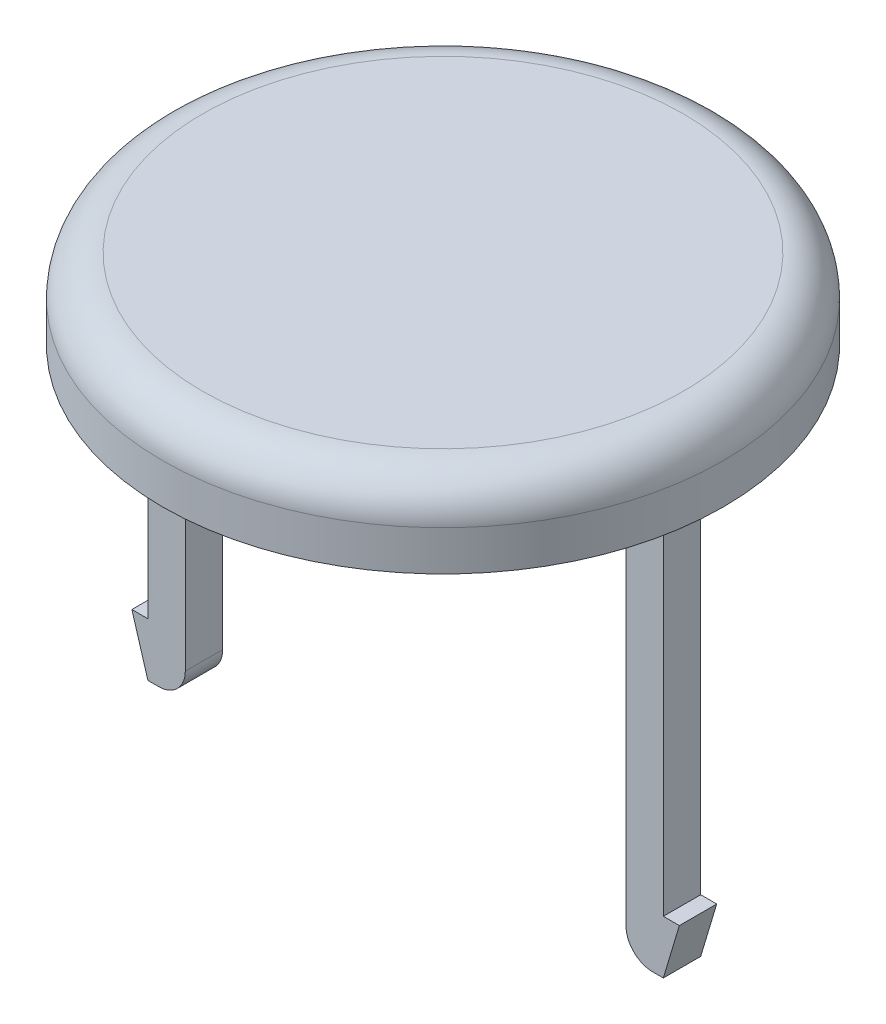
ISO-10303-21;
HEADER;
FILE_DESCRIPTION(('STEP AP214'),'2;1');
FILE_NAME('part.step','',(''),(''),'','','');
FILE_SCHEMA(('AUTOMOTIVE_DESIGN { 1 0 10303 214 1 1 1 1 }'));
ENDSEC;
DATA;
#1=APPLICATION_CONTEXT('core data for automotive mechanical design processes');
#2=APPLICATION_PROTOCOL_DEFINITION('international standard','automotive_design',2000,#1);
#3=PRODUCT_CONTEXT('',#1,'mechanical');
#4=PRODUCT('Part','Part','',(#3));
#5=PRODUCT_RELATED_PRODUCT_CATEGORY('part','',(#4));
#6=PRODUCT_DEFINITION_FORMATION('','',#4);
#7=PRODUCT_DEFINITION_CONTEXT('part definition',#1,'design');
#8=PRODUCT_DEFINITION('design','',#6,#7);
#9=PRODUCT_DEFINITION_SHAPE('','',#8);
#10=(LENGTH_UNIT() NAMED_UNIT(*) SI_UNIT(.MILLI.,.METRE.));
#11=(NAMED_UNIT(*) PLANE_ANGLE_UNIT() SI_UNIT($,.RADIAN.));
#12=(NAMED_UNIT(*) SI_UNIT($,.STERADIAN.) SOLID_ANGLE_UNIT());
#13=UNCERTAINTY_MEASURE_WITH_UNIT(LENGTH_MEASURE(1.E-05),#10,'distance_accuracy_value','');
#14=(GEOMETRIC_REPRESENTATION_CONTEXT(3) GLOBAL_UNCERTAINTY_ASSIGNED_CONTEXT((#13)) GLOBAL_UNIT_ASSIGNED_CONTEXT((#10,
#11,#12)) REPRESENTATION_CONTEXT('',''));
#15=CARTESIAN_POINT('',(0.,0.,0.));
#16=DIRECTION('',(0.,0.,1.));
#17=DIRECTION('',(1.,0.,0.));
#18=AXIS2_PLACEMENT_3D('',#15,#16,#17);
#19=CARTESIAN_POINT('',(9.65,-15.,0.));
#20=DIRECTION('',(-1.,0.,0.));
#21=DIRECTION('',(0.,0.,1.));
#22=AXIS2_PLACEMENT_3D('',#19,#20,#21);
#23=PLANE('',#22);
#24=DIRECTION('',(0.,0.,1.));
#25=VECTOR('',#24,1.);
#26=CARTESIAN_POINT('',(9.65,-13.,-2.08806130178211));
#27=LINE('',#26,#25);
#28=CARTESIAN_POINT('',(9.65,-13.,0.));
#29=VERTEX_POINT('',#28);
#30=CARTESIAN_POINT('',(9.65,-13.,1.4));
#31=VERTEX_POINT('',#30);
#32=EDGE_CURVE('E146',#29,#31,#27,.T.);
#33=ORIENTED_EDGE('',*,*,#32,.F.);
#34=DIRECTION('',(0.,1.,0.));
#35=VECTOR('',#34,1.);
#36=CARTESIAN_POINT('',(9.65,-15.,0.));
#37=LINE('',#36,#35);
#38=CARTESIAN_POINT('',(9.65,0.,0.));
#39=VERTEX_POINT('',#38);
#40=EDGE_CURVE('E160',#29,#39,#37,.T.);
#41=ORIENTED_EDGE('',*,*,#40,.T.);
#42=DIRECTION('',(0.,0.,1.));
#43=VECTOR('',#42,1.);
#44=CARTESIAN_POINT('',(9.65,0.,0.));
#45=LINE('',#44,#43);
#46=CARTESIAN_POINT('',(9.65,0.,1.4));
#47=VERTEX_POINT('',#46);
#48=EDGE_CURVE('E363',#39,#47,#45,.T.);
#49=ORIENTED_EDGE('',*,*,#48,.T.);
#50=DIRECTION('',(0.,1.,0.));
#51=VECTOR('',#50,1.);
#52=CARTESIAN_POINT('',(9.65,-15.,1.4));
#53=LINE('',#52,#51);
#54=EDGE_CURVE('E162',#31,#47,#53,.T.);
#55=ORIENTED_EDGE('',*,*,#54,.F.);
#56=EDGE_LOOP('',(#33,#41,#49,#55));
#57=FACE_BOUND('',#56,.T.);
#58=ADVANCED_FACE('F41',(#57),#23,.F.);
#59=CARTESIAN_POINT('',(0.,0.,0.));
#60=DIRECTION('',(0.,1.,0.));
#61=DIRECTION('',(0.,0.,1.));
#62=AXIS2_PLACEMENT_3D('',#59,#60,#61);
#63=PLANE('',#62);
#64=CARTESIAN_POINT('',(0.,0.,0.));
#65=DIRECTION('',(0.,1.,0.));
#66=DIRECTION('',(0.,0.,1.));
#67=AXIS2_PLACEMENT_3D('',#64,#65,#66);
#68=CIRCLE('',#67,10.5);
#69=CARTESIAN_POINT('',(0.,0.,10.5));
#70=VERTEX_POINT('',#69);
#71=EDGE_CURVE('E247',#70,#70,#68,.T.);
#72=ORIENTED_EDGE('',*,*,#71,.F.);
#73=EDGE_LOOP('',(#72));
#74=FACE_BOUND('',#73,.T.);
#75=DIRECTION('',(-1.,0.,0.));
#76=VECTOR('',#75,1.);
#77=CARTESIAN_POINT('',(0.,0.,0.));
#78=LINE('',#77,#76);
#79=CARTESIAN_POINT('',(-8.25,0.,0.));
#80=VERTEX_POINT('',#79);
#81=CARTESIAN_POINT('',(-9.65,0.,0.));
#82=VERTEX_POINT('',#81);
#83=EDGE_CURVE('E225',#80,#82,#78,.T.);
#84=ORIENTED_EDGE('',*,*,#83,.T.);
#85=DIRECTION('',(0.,0.,1.));
#86=VECTOR('',#85,1.);
#87=CARTESIAN_POINT('',(-9.65,0.,0.));
#88=LINE('',#87,#86);
#89=CARTESIAN_POINT('',(-9.65,0.,1.4));
#90=VERTEX_POINT('',#89);
#91=EDGE_CURVE('E200',#82,#90,#88,.T.);
#92=ORIENTED_EDGE('',*,*,#91,.T.);
#93=DIRECTION('',(-1.,0.,0.));
#94=VECTOR('',#93,1.);
#95=CARTESIAN_POINT('',(0.,0.,1.4));
#96=LINE('',#95,#94);
#97=CARTESIAN_POINT('',(-8.25,0.,1.4));
#98=VERTEX_POINT('',#97);
#99=EDGE_CURVE('E215',#98,#90,#96,.T.);
#100=ORIENTED_EDGE('',*,*,#99,.F.);
#101=DIRECTION('',(0.,0.,1.));
#102=VECTOR('',#101,1.);
#103=CARTESIAN_POINT('',(-8.25,0.,0.));
#104=LINE('',#103,#102);
#105=EDGE_CURVE('E229',#80,#98,#104,.T.);
#106=ORIENTED_EDGE('',*,*,#105,.F.);
#107=EDGE_LOOP('',(#84,#92,#100,#106));
#108=FACE_BOUND('',#107,.T.);
#109=ORIENTED_EDGE('',*,*,#48,.F.);
#110=DIRECTION('',(1.,0.,0.));
#111=VECTOR('',#110,1.);
#112=CARTESIAN_POINT('',(0.,0.,0.));
#113=LINE('',#112,#111);
#114=CARTESIAN_POINT('',(8.25,0.,0.));
#115=VERTEX_POINT('',#114);
#116=EDGE_CURVE('E169',#115,#39,#113,.T.);
#117=ORIENTED_EDGE('',*,*,#116,.F.);
#118=DIRECTION('',(0.,0.,1.));
#119=VECTOR('',#118,1.);
#120=CARTESIAN_POINT('',(8.25,0.,0.));
#121=LINE('',#120,#119);
#122=CARTESIAN_POINT('',(8.25,0.,1.4));
#123=VERTEX_POINT('',#122);
#124=EDGE_CURVE('E372',#115,#123,#121,.T.);
#125=ORIENTED_EDGE('',*,*,#124,.T.);
#126=DIRECTION('',(1.,0.,0.));
#127=VECTOR('',#126,1.);
#128=CARTESIAN_POINT('',(0.,0.,1.4));
#129=LINE('',#128,#127);
#130=EDGE_CURVE('E367',#123,#47,#129,.T.);
#131=ORIENTED_EDGE('',*,*,#130,.T.);
#132=EDGE_LOOP('',(#109,#117,#125,#131));
#133=FACE_BOUND('',#132,.T.);
#134=ADVANCED_FACE('F290',(#74,#108,#133),#63,.F.);
#135=CARTESIAN_POINT('',(0.,3.,0.));
#136=DIRECTION('',(0.,-1.,0.));
#137=DIRECTION('',(0.,0.,-1.));
#138=AXIS2_PLACEMENT_3D('',#135,#136,#137);
#139=CYLINDRICAL_SURFACE('',#138,10.5);
#140=CARTESIAN_POINT('',(0.,1.5,0.));
#141=DIRECTION('',(0.,1.,0.));
#142=DIRECTION('',(0.,0.,1.));
#143=AXIS2_PLACEMENT_3D('',#140,#141,#142);
#144=CIRCLE('',#143,10.5);
#145=CARTESIAN_POINT('',(0.,1.5,10.5));
#146=VERTEX_POINT('',#145);
#147=EDGE_CURVE('E11',#146,#146,#144,.F.);
#148=ORIENTED_EDGE('',*,*,#147,.T.);
#149=EDGE_LOOP('',(#148));
#150=FACE_BOUND('',#149,.T.);
#151=ORIENTED_EDGE('',*,*,#71,.T.);
#152=EDGE_LOOP('',(#151));
#153=FACE_BOUND('',#152,.T.);
#154=ADVANCED_FACE('F295',(#150,#153),#139,.T.);
#155=CARTESIAN_POINT('',(0.,3.,0.));
#156=DIRECTION('',(0.,1.,0.));
#157=DIRECTION('',(0.,0.,1.));
#158=AXIS2_PLACEMENT_3D('',#155,#156,#157);
#159=PLANE('',#158);
#160=CARTESIAN_POINT('',(0.,3.,0.));
#161=DIRECTION('',(0.,1.,0.));
#162=DIRECTION('',(0.,0.,1.));
#163=AXIS2_PLACEMENT_3D('',#160,#161,#162);
#164=CIRCLE('',#163,9.);
#165=CARTESIAN_POINT('',(0.,3.,9.));
#166=VERTEX_POINT('',#165);
#167=EDGE_CURVE('E50',#166,#166,#164,.T.);
#168=ORIENTED_EDGE('',*,*,#167,.T.);
#169=EDGE_LOOP('',(#168));
#170=FACE_BOUND('',#169,.T.);
#171=ADVANCED_FACE('F278',(#170),#159,.T.);
#172=CARTESIAN_POINT('',(-9.65,-15.,0.));
#173=DIRECTION('',(-1.,0.,0.));
#174=DIRECTION('',(0.,0.,1.));
#175=AXIS2_PLACEMENT_3D('',#172,#173,#174);
#176=PLANE('',#175);
#177=DIRECTION('',(0.,0.,1.));
#178=VECTOR('',#177,1.);
#179=CARTESIAN_POINT('',(-9.65,-13.,-2.08806130178211));
#180=LINE('',#179,#178);
#181=CARTESIAN_POINT('',(-9.65,-13.,0.));
#182=VERTEX_POINT('',#181);
#183=CARTESIAN_POINT('',(-9.65,-13.,1.4));
#184=VERTEX_POINT('',#183);
#185=EDGE_CURVE('E192',#182,#184,#180,.T.);
#186=ORIENTED_EDGE('',*,*,#185,.T.);
#187=DIRECTION('',(0.,1.,0.));
#188=VECTOR('',#187,1.);
#189=CARTESIAN_POINT('',(-9.65,-15.,1.4));
#190=LINE('',#189,#188);
#191=EDGE_CURVE('E221',#184,#90,#190,.T.);
#192=ORIENTED_EDGE('',*,*,#191,.T.);
#193=ORIENTED_EDGE('',*,*,#91,.F.);
#194=DIRECTION('',(0.,1.,0.));
#195=VECTOR('',#194,1.);
#196=CARTESIAN_POINT('',(-9.65,-15.,0.));
#197=LINE('',#196,#195);
#198=EDGE_CURVE('E244',#182,#82,#197,.T.);
#199=ORIENTED_EDGE('',*,*,#198,.F.);
#200=EDGE_LOOP('',(#186,#192,#193,#199));
#201=FACE_BOUND('',#200,.T.);
#202=ADVANCED_FACE('F325',(#201),#176,.T.);
#203=CARTESIAN_POINT('',(0.,-15.,0.));
#204=DIRECTION('',(0.,0.,-1.));
#205=DIRECTION('',(-1.,0.,0.));
#206=AXIS2_PLACEMENT_3D('',#203,#204,#205);
#207=PLANE('',#206);
#208=DIRECTION('',(0.,1.,0.));
#209=VECTOR('',#208,1.);
#210=CARTESIAN_POINT('',(-8.25,-15.,0.));
#211=LINE('',#210,#209);
#212=CARTESIAN_POINT('',(-8.25,-14.,0.));
#213=VERTEX_POINT('',#212);
#214=EDGE_CURVE('E241',#213,#80,#211,.T.);
#215=ORIENTED_EDGE('',*,*,#214,.F.);
#216=CARTESIAN_POINT('',(-9.25,-14.,0.));
#217=DIRECTION('',(0.,0.,-1.));
#218=DIRECTION('',(-1.,0.,0.));
#219=AXIS2_PLACEMENT_3D('',#216,#217,#218);
#220=CIRCLE('',#219,1.);
#221=CARTESIAN_POINT('',(-9.25,-15.,0.));
#222=VERTEX_POINT('',#221);
#223=EDGE_CURVE('E261',#213,#222,#220,.T.);
#224=ORIENTED_EDGE('',*,*,#223,.T.);
#225=DIRECTION('',(-1.,0.,0.));
#226=VECTOR('',#225,1.);
#227=CARTESIAN_POINT('',(0.,-15.,0.));
#228=LINE('',#227,#226);
#229=CARTESIAN_POINT('',(-9.65,-15.,0.));
#230=VERTEX_POINT('',#229);
#231=EDGE_CURVE('E214',#222,#230,#228,.T.);
#232=ORIENTED_EDGE('',*,*,#231,.T.);
#233=DIRECTION('',(0.287347885566345,-0.957826285221151,0.));
#234=VECTOR('',#233,1.);
#235=CARTESIAN_POINT('',(-10.25,-13.,0.));
#236=LINE('',#235,#234);
#237=CARTESIAN_POINT('',(-10.25,-13.,0.));
#238=VERTEX_POINT('',#237);
#239=EDGE_CURVE('E196',#238,#230,#236,.T.);
#240=ORIENTED_EDGE('',*,*,#239,.F.);
#241=DIRECTION('',(-1.,0.,0.));
#242=VECTOR('',#241,1.);
#243=CARTESIAN_POINT('',(-9.65,-13.,0.));
#244=LINE('',#243,#242);
#245=EDGE_CURVE('E202',#182,#238,#244,.T.);
#246=ORIENTED_EDGE('',*,*,#245,.F.);
#247=ORIENTED_EDGE('',*,*,#198,.T.);
#248=ORIENTED_EDGE('',*,*,#83,.F.);
#249=EDGE_LOOP('',(#215,#224,#232,#240,#246,#247,#248));
#250=FACE_BOUND('',#249,.T.);
#251=ADVANCED_FACE('F321',(#250),#207,.T.);
#252=CARTESIAN_POINT('',(-8.25,-15.,0.));
#253=DIRECTION('',(-1.,0.,0.));
#254=DIRECTION('',(0.,0.,1.));
#255=AXIS2_PLACEMENT_3D('',#252,#253,#254);
#256=PLANE('',#255);
#257=DIRECTION('',(0.,1.,0.));
#258=VECTOR('',#257,1.);
#259=CARTESIAN_POINT('',(-8.25,-15.,1.4));
#260=LINE('',#259,#258);
#261=CARTESIAN_POINT('',(-8.25,-14.,1.4));
#262=VERTEX_POINT('',#261);
#263=EDGE_CURVE('E238',#262,#98,#260,.T.);
#264=ORIENTED_EDGE('',*,*,#263,.F.);
#265=DIRECTION('',(0.,0.,1.));
#266=VECTOR('',#265,1.);
#267=CARTESIAN_POINT('',(-8.25,-14.,0.));
#268=LINE('',#267,#266);
#269=EDGE_CURVE('E258',#262,#213,#268,.F.);
#270=ORIENTED_EDGE('',*,*,#269,.T.);
#271=ORIENTED_EDGE('',*,*,#214,.T.);
#272=ORIENTED_EDGE('',*,*,#105,.T.);
#273=EDGE_LOOP('',(#264,#270,#271,#272));
#274=FACE_BOUND('',#273,.T.);
#275=ADVANCED_FACE('F317',(#274),#256,.F.);
#276=CARTESIAN_POINT('',(0.,-15.,1.4));
#277=DIRECTION('',(0.,0.,-1.));
#278=DIRECTION('',(-1.,0.,0.));
#279=AXIS2_PLACEMENT_3D('',#276,#277,#278);
#280=PLANE('',#279);
#281=DIRECTION('',(-1.,0.,0.));
#282=VECTOR('',#281,1.);
#283=CARTESIAN_POINT('',(0.,-15.,1.4));
#284=LINE('',#283,#282);
#285=CARTESIAN_POINT('',(-9.25,-15.,1.4));
#286=VERTEX_POINT('',#285);
#287=CARTESIAN_POINT('',(-9.65,-15.,1.4));
#288=VERTEX_POINT('',#287);
#289=EDGE_CURVE('E218',#286,#288,#284,.T.);
#290=ORIENTED_EDGE('',*,*,#289,.F.);
#291=CARTESIAN_POINT('',(-9.25,-14.,1.4));
#292=DIRECTION('',(0.,0.,-1.));
#293=DIRECTION('',(-1.,0.,0.));
#294=AXIS2_PLACEMENT_3D('',#291,#292,#293);
#295=CIRCLE('',#294,1.);
#296=EDGE_CURVE('E255',#286,#262,#295,.F.);
#297=ORIENTED_EDGE('',*,*,#296,.T.);
#298=ORIENTED_EDGE('',*,*,#263,.T.);
#299=ORIENTED_EDGE('',*,*,#99,.T.);
#300=ORIENTED_EDGE('',*,*,#191,.F.);
#301=DIRECTION('',(-1.,0.,0.));
#302=VECTOR('',#301,1.);
#303=CARTESIAN_POINT('',(-9.65,-13.,1.4));
#304=LINE('',#303,#302);
#305=CARTESIAN_POINT('',(-10.25,-13.,1.4));
#306=VERTEX_POINT('',#305);
#307=EDGE_CURVE('E188',#184,#306,#304,.T.);
#308=ORIENTED_EDGE('',*,*,#307,.T.);
#309=DIRECTION('',(0.287347885566345,-0.957826285221151,0.));
#310=VECTOR('',#309,1.);
#311=CARTESIAN_POINT('',(-10.25,-13.,1.4));
#312=LINE('',#311,#310);
#313=EDGE_CURVE('E187',#306,#288,#312,.T.);
#314=ORIENTED_EDGE('',*,*,#313,.T.);
#315=EDGE_LOOP('',(#290,#297,#298,#299,#300,#308,#314));
#316=FACE_BOUND('',#315,.T.);
#317=ADVANCED_FACE('F313',(#316),#280,.F.);
#318=CARTESIAN_POINT('',(0.,-15.,0.));
#319=DIRECTION('',(0.,-1.,0.));
#320=DIRECTION('',(0.,0.,-1.));
#321=AXIS2_PLACEMENT_3D('',#318,#319,#320);
#322=PLANE('',#321);
#323=ORIENTED_EDGE('',*,*,#231,.F.);
#324=DIRECTION('',(0.,0.,1.));
#325=VECTOR('',#324,1.);
#326=CARTESIAN_POINT('',(-9.25,-15.,1.4));
#327=LINE('',#326,#325);
#328=EDGE_CURVE('E251',#222,#286,#327,.T.);
#329=ORIENTED_EDGE('',*,*,#328,.T.);
#330=ORIENTED_EDGE('',*,*,#289,.T.);
#331=DIRECTION('',(0.,0.,1.));
#332=VECTOR('',#331,1.);
#333=CARTESIAN_POINT('',(-9.65,-15.,0.));
#334=LINE('',#333,#332);
#335=EDGE_CURVE('E210',#230,#288,#334,.T.);
#336=ORIENTED_EDGE('',*,*,#335,.F.);
#337=EDGE_LOOP('',(#323,#329,#330,#336));
#338=FACE_BOUND('',#337,.T.);
#339=ADVANCED_FACE('F309',(#338),#322,.T.);
#340=CARTESIAN_POINT('',(-9.65,-13.,-2.08806130178211));
#341=DIRECTION('',(0.,1.,0.));
#342=DIRECTION('',(0.,0.,1.));
#343=AXIS2_PLACEMENT_3D('',#340,#341,#342);
#344=PLANE('',#343);
#345=ORIENTED_EDGE('',*,*,#185,.F.);
#346=ORIENTED_EDGE('',*,*,#245,.T.);
#347=DIRECTION('',(0.,0.,1.));
#348=VECTOR('',#347,1.);
#349=CARTESIAN_POINT('',(-10.25,-13.,-2.08806130178211));
#350=LINE('',#349,#348);
#351=EDGE_CURVE('E201',#238,#306,#350,.T.);
#352=ORIENTED_EDGE('',*,*,#351,.T.);
#353=ORIENTED_EDGE('',*,*,#307,.F.);
#354=EDGE_LOOP('',(#345,#346,#352,#353));
#355=FACE_BOUND('',#354,.T.);
#356=ADVANCED_FACE('F305',(#355),#344,.T.);
#357=CARTESIAN_POINT('',(-10.25,-13.,-2.08806130178211));
#358=DIRECTION('',(-0.957826285221151,-0.287347885566345,0.));
#359=DIRECTION('',(0.287347885566345,-0.957826285221151,0.));
#360=AXIS2_PLACEMENT_3D('',#357,#358,#359);
#361=PLANE('',#360);
#362=ORIENTED_EDGE('',*,*,#351,.F.);
#363=ORIENTED_EDGE('',*,*,#239,.T.);
#364=ORIENTED_EDGE('',*,*,#335,.T.);
#365=ORIENTED_EDGE('',*,*,#313,.F.);
#366=EDGE_LOOP('',(#362,#363,#364,#365));
#367=FACE_BOUND('',#366,.T.);
#368=ADVANCED_FACE('F302',(#367),#361,.T.);
#369=CARTESIAN_POINT('',(0.,-15.,1.4));
#370=DIRECTION('',(0.,0.,1.));
#371=DIRECTION('',(1.,0.,0.));
#372=AXIS2_PLACEMENT_3D('',#369,#370,#371);
#373=PLANE('',#372);
#374=DIRECTION('',(0.,1.,0.));
#375=VECTOR('',#374,1.);
#376=CARTESIAN_POINT('',(8.25,-15.,1.4));
#377=LINE('',#376,#375);
#378=CARTESIAN_POINT('',(8.25,-14.,1.4));
#379=VERTEX_POINT('',#378);
#380=EDGE_CURVE('E176',#379,#123,#377,.T.);
#381=ORIENTED_EDGE('',*,*,#380,.F.);
#382=CARTESIAN_POINT('',(9.25,-14.,1.4));
#383=DIRECTION('',(0.,0.,1.));
#384=DIRECTION('',(1.,0.,0.));
#385=AXIS2_PLACEMENT_3D('',#382,#383,#384);
#386=CIRCLE('',#385,1.);
#387=CARTESIAN_POINT('',(9.25,-15.,1.4));
#388=VERTEX_POINT('',#387);
#389=EDGE_CURVE('E65',#379,#388,#386,.T.);
#390=ORIENTED_EDGE('',*,*,#389,.T.);
#391=DIRECTION('',(1.,0.,0.));
#392=VECTOR('',#391,1.);
#393=CARTESIAN_POINT('',(0.,-15.,1.4));
#394=LINE('',#393,#392);
#395=CARTESIAN_POINT('',(9.65,-15.,1.4));
#396=VERTEX_POINT('',#395);
#397=EDGE_CURVE('E178',#388,#396,#394,.T.);
#398=ORIENTED_EDGE('',*,*,#397,.T.);
#399=DIRECTION('',(-0.287347885566345,-0.957826285221151,0.));
#400=VECTOR('',#399,1.);
#401=CARTESIAN_POINT('',(10.25,-13.,1.4));
#402=LINE('',#401,#400);
#403=CARTESIAN_POINT('',(10.25,-13.,1.4));
#404=VERTEX_POINT('',#403);
#405=EDGE_CURVE('E164',#404,#396,#402,.T.);
#406=ORIENTED_EDGE('',*,*,#405,.F.);
#407=DIRECTION('',(1.,0.,0.));
#408=VECTOR('',#407,1.);
#409=CARTESIAN_POINT('',(9.65,-13.,1.4));
#410=LINE('',#409,#408);
#411=EDGE_CURVE('E155',#31,#404,#410,.T.);
#412=ORIENTED_EDGE('',*,*,#411,.F.);
#413=ORIENTED_EDGE('',*,*,#54,.T.);
#414=ORIENTED_EDGE('',*,*,#130,.F.);
#415=EDGE_LOOP('',(#381,#390,#398,#406,#412,#413,#414));
#416=FACE_BOUND('',#415,.T.);
#417=ADVANCED_FACE('F300',(#416),#373,.T.);
#418=CARTESIAN_POINT('',(8.25,-15.,0.));
#419=DIRECTION('',(-1.,0.,0.));
#420=DIRECTION('',(0.,0.,1.));
#421=AXIS2_PLACEMENT_3D('',#418,#419,#420);
#422=PLANE('',#421);
#423=DIRECTION('',(0.,1.,0.));
#424=VECTOR('',#423,1.);
#425=CARTESIAN_POINT('',(8.25,-15.,0.));
#426=LINE('',#425,#424);
#427=CARTESIAN_POINT('',(8.25,-14.,0.));
#428=VERTEX_POINT('',#427);
#429=EDGE_CURVE('E171',#428,#115,#426,.T.);
#430=ORIENTED_EDGE('',*,*,#429,.F.);
#431=DIRECTION('',(0.,0.,1.));
#432=VECTOR('',#431,1.);
#433=CARTESIAN_POINT('',(8.25,-14.,0.));
#434=LINE('',#433,#432);
#435=EDGE_CURVE('E264',#428,#379,#434,.T.);
#436=ORIENTED_EDGE('',*,*,#435,.T.);
#437=ORIENTED_EDGE('',*,*,#380,.T.);
#438=ORIENTED_EDGE('',*,*,#124,.F.);
#439=EDGE_LOOP('',(#430,#436,#437,#438));
#440=FACE_BOUND('',#439,.T.);
#441=ADVANCED_FACE('F397',(#440),#422,.T.);
#442=CARTESIAN_POINT('',(0.,-15.,0.));
#443=DIRECTION('',(0.,0.,1.));
#444=DIRECTION('',(1.,0.,0.));
#445=AXIS2_PLACEMENT_3D('',#442,#443,#444);
#446=PLANE('',#445);
#447=DIRECTION('',(1.,0.,0.));
#448=VECTOR('',#447,1.);
#449=CARTESIAN_POINT('',(0.,-15.,0.));
#450=LINE('',#449,#448);
#451=CARTESIAN_POINT('',(9.25,-15.,0.));
#452=VERTEX_POINT('',#451);
#453=CARTESIAN_POINT('',(9.65,-15.,0.));
#454=VERTEX_POINT('',#453);
#455=EDGE_CURVE('E172',#452,#454,#450,.T.);
#456=ORIENTED_EDGE('',*,*,#455,.F.);
#457=CARTESIAN_POINT('',(9.25,-14.,0.));
#458=DIRECTION('',(0.,0.,1.));
#459=DIRECTION('',(1.,0.,0.));
#460=AXIS2_PLACEMENT_3D('',#457,#458,#459);
#461=CIRCLE('',#460,1.);
#462=EDGE_CURVE('E272',#452,#428,#461,.F.);
#463=ORIENTED_EDGE('',*,*,#462,.T.);
#464=ORIENTED_EDGE('',*,*,#429,.T.);
#465=ORIENTED_EDGE('',*,*,#116,.T.);
#466=ORIENTED_EDGE('',*,*,#40,.F.);
#467=DIRECTION('',(1.,0.,0.));
#468=VECTOR('',#467,1.);
#469=CARTESIAN_POINT('',(9.65,-13.,0.));
#470=LINE('',#469,#468);
#471=CARTESIAN_POINT('',(10.25,-13.,0.));
#472=VERTEX_POINT('',#471);
#473=EDGE_CURVE('E142',#29,#472,#470,.T.);
#474=ORIENTED_EDGE('',*,*,#473,.T.);
#475=DIRECTION('',(-0.287347885566345,-0.957826285221151,0.));
#476=VECTOR('',#475,1.);
#477=CARTESIAN_POINT('',(10.25,-13.,0.));
#478=LINE('',#477,#476);
#479=EDGE_CURVE('E154',#472,#454,#478,.T.);
#480=ORIENTED_EDGE('',*,*,#479,.T.);
#481=EDGE_LOOP('',(#456,#463,#464,#465,#466,#474,#480));
#482=FACE_BOUND('',#481,.T.);
#483=ADVANCED_FACE('F167',(#482),#446,.F.);
#484=CARTESIAN_POINT('',(0.,-15.,0.));
#485=DIRECTION('',(0.,-1.,0.));
#486=DIRECTION('',(0.,0.,-1.));
#487=AXIS2_PLACEMENT_3D('',#484,#485,#486);
#488=PLANE('',#487);
#489=ORIENTED_EDGE('',*,*,#397,.F.);
#490=DIRECTION('',(0.,0.,1.));
#491=VECTOR('',#490,1.);
#492=CARTESIAN_POINT('',(9.25,-15.,0.));
#493=LINE('',#492,#491);
#494=EDGE_CURVE('E57',#388,#452,#493,.F.);
#495=ORIENTED_EDGE('',*,*,#494,.T.);
#496=ORIENTED_EDGE('',*,*,#455,.T.);
#497=DIRECTION('',(0.,0.,1.));
#498=VECTOR('',#497,1.);
#499=CARTESIAN_POINT('',(9.65,-15.,0.));
#500=LINE('',#499,#498);
#501=EDGE_CURVE('E378',#454,#396,#500,.T.);
#502=ORIENTED_EDGE('',*,*,#501,.T.);
#503=EDGE_LOOP('',(#489,#495,#496,#502));
#504=FACE_BOUND('',#503,.T.);
#505=ADVANCED_FACE('F403',(#504),#488,.T.);
#506=CARTESIAN_POINT('',(10.25,-13.,-2.08806130178211));
#507=DIRECTION('',(-0.957826285221151,0.287347885566345,0.));
#508=DIRECTION('',(-0.287347885566345,-0.957826285221151,0.));
#509=AXIS2_PLACEMENT_3D('',#506,#507,#508);
#510=PLANE('',#509);
#511=ORIENTED_EDGE('',*,*,#479,.F.);
#512=DIRECTION('',(0.,0.,1.));
#513=VECTOR('',#512,1.);
#514=CARTESIAN_POINT('',(10.25,-13.,-2.08806130178211));
#515=LINE('',#514,#513);
#516=EDGE_CURVE('E148',#472,#404,#515,.T.);
#517=ORIENTED_EDGE('',*,*,#516,.T.);
#518=ORIENTED_EDGE('',*,*,#405,.T.);
#519=ORIENTED_EDGE('',*,*,#501,.F.);
#520=EDGE_LOOP('',(#511,#517,#518,#519));
#521=FACE_BOUND('',#520,.T.);
#522=ADVANCED_FACE('F340',(#521),#510,.F.);
#523=CARTESIAN_POINT('',(9.65,-13.,-2.08806130178211));
#524=DIRECTION('',(0.,-1.,0.));
#525=DIRECTION('',(0.,0.,-1.));
#526=AXIS2_PLACEMENT_3D('',#523,#524,#525);
#527=PLANE('',#526);
#528=ORIENTED_EDGE('',*,*,#473,.F.);
#529=ORIENTED_EDGE('',*,*,#32,.T.);
#530=ORIENTED_EDGE('',*,*,#411,.T.);
#531=ORIENTED_EDGE('',*,*,#516,.F.);
#532=EDGE_LOOP('',(#528,#529,#530,#531));
#533=FACE_BOUND('',#532,.T.);
#534=ADVANCED_FACE('F144',(#533),#527,.F.);
#535=CARTESIAN_POINT('',(-9.25,-14.,0.));
#536=DIRECTION('',(0.,0.,-1.));
#537=DIRECTION('',(-1.,0.,0.));
#538=AXIS2_PLACEMENT_3D('',#535,#536,#537);
#539=CYLINDRICAL_SURFACE('',#538,1.);
#540=ORIENTED_EDGE('',*,*,#223,.F.);
#541=ORIENTED_EDGE('',*,*,#269,.F.);
#542=ORIENTED_EDGE('',*,*,#296,.F.);
#543=ORIENTED_EDGE('',*,*,#328,.F.);
#544=EDGE_LOOP('',(#540,#541,#542,#543));
#545=FACE_BOUND('',#544,.T.);
#546=ADVANCED_FACE('F286',(#545),#539,.T.);
#547=CARTESIAN_POINT('',(9.25,-14.,0.));
#548=DIRECTION('',(0.,0.,1.));
#549=DIRECTION('',(1.,0.,0.));
#550=AXIS2_PLACEMENT_3D('',#547,#548,#549);
#551=CYLINDRICAL_SURFACE('',#550,1.);
#552=ORIENTED_EDGE('',*,*,#462,.F.);
#553=ORIENTED_EDGE('',*,*,#494,.F.);
#554=ORIENTED_EDGE('',*,*,#389,.F.);
#555=ORIENTED_EDGE('',*,*,#435,.F.);
#556=EDGE_LOOP('',(#552,#553,#554,#555));
#557=FACE_BOUND('',#556,.T.);
#558=ADVANCED_FACE('F281',(#557),#551,.T.);
#559=CARTESIAN_POINT('',(0.,1.5,0.));
#560=DIRECTION('',(0.,1.,0.));
#561=DIRECTION('',(0.,0.,1.));
#562=AXIS2_PLACEMENT_3D('',#559,#560,#561);
#563=TOROIDAL_SURFACE('',#562,9.,1.5);
#564=ORIENTED_EDGE('',*,*,#147,.F.);
#565=EDGE_LOOP('',(#564));
#566=FACE_BOUND('',#565,.T.);
#567=ORIENTED_EDGE('',*,*,#167,.F.);
#568=EDGE_LOOP('',(#567));
#569=FACE_BOUND('',#568,.T.);
#570=ADVANCED_FACE('F43',(#566,#569),#563,.T.);
#571=CLOSED_SHELL('',(#58,#134,#154,#171,#202,#251,#275,#317,#339,#356,#368,#417,#441,#483,#505,
#522,#534,#546,#558,#570));
#572=MANIFOLD_SOLID_BREP('B2',#571);
#573=ADVANCED_BREP_SHAPE_REPRESENTATION('',(#18,#572),#14);
#574=SHAPE_DEFINITION_REPRESENTATION(#9,#573);
ENDSEC;
END-ISO-10303-21;
